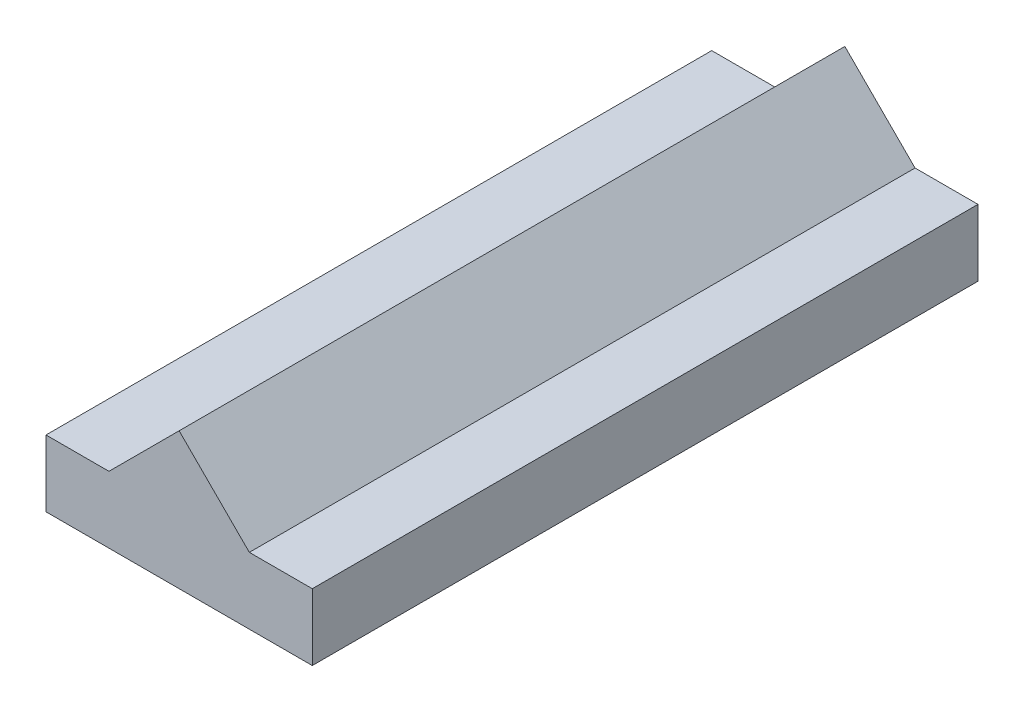
ISO-10303-21;
HEADER;
FILE_DESCRIPTION(('STEP AP214'),'2;1');
FILE_NAME('part.step','',(''),(''),'','','');
FILE_SCHEMA(('AUTOMOTIVE_DESIGN { 1 0 10303 214 1 1 1 1 }'));
ENDSEC;
DATA;
#1=APPLICATION_CONTEXT('core data for automotive mechanical design processes');
#2=APPLICATION_PROTOCOL_DEFINITION('international standard','automotive_design',2000,#1);
#3=PRODUCT_CONTEXT('',#1,'mechanical');
#4=PRODUCT('Part','Part','',(#3));
#5=PRODUCT_RELATED_PRODUCT_CATEGORY('part','',(#4));
#6=PRODUCT_DEFINITION_FORMATION('','',#4);
#7=PRODUCT_DEFINITION_CONTEXT('part definition',#1,'design');
#8=PRODUCT_DEFINITION('design','',#6,#7);
#9=PRODUCT_DEFINITION_SHAPE('','',#8);
#10=(LENGTH_UNIT() NAMED_UNIT(*) SI_UNIT(.MILLI.,.METRE.));
#11=(NAMED_UNIT(*) PLANE_ANGLE_UNIT() SI_UNIT($,.RADIAN.));
#12=(NAMED_UNIT(*) SI_UNIT($,.STERADIAN.) SOLID_ANGLE_UNIT());
#13=UNCERTAINTY_MEASURE_WITH_UNIT(LENGTH_MEASURE(1.E-05),#10,'distance_accuracy_value','');
#14=(GEOMETRIC_REPRESENTATION_CONTEXT(3) GLOBAL_UNCERTAINTY_ASSIGNED_CONTEXT((#13)) GLOBAL_UNIT_ASSIGNED_CONTEXT((#10,
#11,#12)) REPRESENTATION_CONTEXT('',''));
#15=CARTESIAN_POINT('',(0.,0.,0.));
#16=DIRECTION('',(0.,0.,1.));
#17=DIRECTION('',(1.,0.,0.));
#18=AXIS2_PLACEMENT_3D('',#15,#16,#17);
#19=CARTESIAN_POINT('',(-9.99999999999999,0.,50.));
#20=DIRECTION('',(0.,1.,0.));
#21=DIRECTION('',(-1.,0.,0.));
#22=AXIS2_PLACEMENT_3D('',#19,#20,#21);
#23=PLANE('',#22);
#24=DIRECTION('',(1.,0.,0.));
#25=VECTOR('',#24,1.);
#26=CARTESIAN_POINT('',(-9.99999999999999,0.,0.));
#27=LINE('',#26,#25);
#28=CARTESIAN_POINT('',(-9.99999999999999,0.,0.));
#29=VERTEX_POINT('',#28);
#30=CARTESIAN_POINT('',(9.99999999999999,0.,0.));
#31=VERTEX_POINT('',#30);
#32=EDGE_CURVE('E136',#29,#31,#27,.T.);
#33=ORIENTED_EDGE('',*,*,#32,.T.);
#34=DIRECTION('',(0.,0.,-1.));
#35=VECTOR('',#34,1.);
#36=CARTESIAN_POINT('',(9.99999999999999,0.,50.));
#37=LINE('',#36,#35);
#38=CARTESIAN_POINT('',(9.99999999999999,0.,50.));
#39=VERTEX_POINT('',#38);
#40=EDGE_CURVE('E12',#39,#31,#37,.T.);
#41=ORIENTED_EDGE('',*,*,#40,.F.);
#42=DIRECTION('',(1.,0.,0.));
#43=VECTOR('',#42,1.);
#44=CARTESIAN_POINT('',(-9.99999999999999,0.,50.));
#45=LINE('',#44,#43);
#46=CARTESIAN_POINT('',(-9.99999999999999,0.,50.));
#47=VERTEX_POINT('',#46);
#48=EDGE_CURVE('E148',#47,#39,#45,.T.);
#49=ORIENTED_EDGE('',*,*,#48,.F.);
#50=DIRECTION('',(0.,0.,-1.));
#51=VECTOR('',#50,1.);
#52=CARTESIAN_POINT('',(-9.99999999999999,0.,50.));
#53=LINE('',#52,#51);
#54=EDGE_CURVE('E132',#47,#29,#53,.T.);
#55=ORIENTED_EDGE('',*,*,#54,.T.);
#56=EDGE_LOOP('',(#33,#41,#49,#55));
#57=FACE_BOUND('',#56,.T.);
#58=ADVANCED_FACE('F46',(#57),#23,.F.);
#59=CARTESIAN_POINT('',(9.99999999999999,0.,50.));
#60=DIRECTION('',(-1.,0.,0.));
#61=DIRECTION('',(0.,-1.,0.));
#62=AXIS2_PLACEMENT_3D('',#59,#60,#61);
#63=PLANE('',#62);
#64=DIRECTION('',(0.,1.,0.));
#65=VECTOR('',#64,1.);
#66=CARTESIAN_POINT('',(9.99999999999999,0.,0.));
#67=LINE('',#66,#65);
#68=CARTESIAN_POINT('',(10.,5.,0.));
#69=VERTEX_POINT('',#68);
#70=EDGE_CURVE('E139',#31,#69,#67,.T.);
#71=ORIENTED_EDGE('',*,*,#70,.T.);
#72=DIRECTION('',(0.,0.,-1.));
#73=VECTOR('',#72,1.);
#74=CARTESIAN_POINT('',(10.,5.,50.));
#75=LINE('',#74,#73);
#76=CARTESIAN_POINT('',(10.,5.,50.));
#77=VERTEX_POINT('',#76);
#78=EDGE_CURVE('E54',#77,#69,#75,.T.);
#79=ORIENTED_EDGE('',*,*,#78,.F.);
#80=DIRECTION('',(0.,1.,0.));
#81=VECTOR('',#80,1.);
#82=CARTESIAN_POINT('',(9.99999999999999,0.,50.));
#83=LINE('',#82,#81);
#84=EDGE_CURVE('E102',#39,#77,#83,.T.);
#85=ORIENTED_EDGE('',*,*,#84,.F.);
#86=ORIENTED_EDGE('',*,*,#40,.T.);
#87=EDGE_LOOP('',(#71,#79,#85,#86));
#88=FACE_BOUND('',#87,.T.);
#89=ADVANCED_FACE('F173',(#88),#63,.F.);
#90=CARTESIAN_POINT('',(10.,5.,50.));
#91=DIRECTION('',(0.,-1.,0.));
#92=DIRECTION('',(1.,0.,0.));
#93=AXIS2_PLACEMENT_3D('',#90,#91,#92);
#94=PLANE('',#93);
#95=DIRECTION('',(-1.,0.,0.));
#96=VECTOR('',#95,1.);
#97=CARTESIAN_POINT('',(10.,5.,0.));
#98=LINE('',#97,#96);
#99=CARTESIAN_POINT('',(5.27179257857634,5.,0.));
#100=VERTEX_POINT('',#99);
#101=EDGE_CURVE('E141',#69,#100,#98,.T.);
#102=ORIENTED_EDGE('',*,*,#101,.T.);
#103=DIRECTION('',(0.,0.,-1.));
#104=VECTOR('',#103,1.);
#105=CARTESIAN_POINT('',(5.27179257857634,5.,50.));
#106=LINE('',#105,#104);
#107=CARTESIAN_POINT('',(5.27179257857634,5.,50.));
#108=VERTEX_POINT('',#107);
#109=EDGE_CURVE('E152',#108,#100,#106,.T.);
#110=ORIENTED_EDGE('',*,*,#109,.F.);
#111=DIRECTION('',(-1.,0.,0.));
#112=VECTOR('',#111,1.);
#113=CARTESIAN_POINT('',(10.,5.,50.));
#114=LINE('',#113,#112);
#115=EDGE_CURVE('E160',#77,#108,#114,.T.);
#116=ORIENTED_EDGE('',*,*,#115,.F.);
#117=ORIENTED_EDGE('',*,*,#78,.T.);
#118=EDGE_LOOP('',(#102,#110,#116,#117));
#119=FACE_BOUND('',#118,.T.);
#120=ADVANCED_FACE('F158',(#119),#94,.F.);
#121=CARTESIAN_POINT('',(5.27179257857634,5.,50.));
#122=DIRECTION('',(-0.707106781186549,-0.707106781186546,0.));
#123=DIRECTION('',(0.707106781186546,-0.707106781186549,0.));
#124=AXIS2_PLACEMENT_3D('',#121,#122,#123);
#125=PLANE('',#124);
#126=DIRECTION('',(-0.707106781186546,0.707106781186549,0.));
#127=VECTOR('',#126,1.);
#128=CARTESIAN_POINT('',(5.27179257857634,5.,0.));
#129=LINE('',#128,#127);
#130=CARTESIAN_POINT('',(0.,10.2717925785764,0.));
#131=VERTEX_POINT('',#130);
#132=EDGE_CURVE('E143',#100,#131,#129,.T.);
#133=ORIENTED_EDGE('',*,*,#132,.T.);
#134=DIRECTION('',(0.,0.,-1.));
#135=VECTOR('',#134,1.);
#136=CARTESIAN_POINT('',(0.,10.2717925785764,50.));
#137=LINE('',#136,#135);
#138=CARTESIAN_POINT('',(0.,10.2717925785764,50.));
#139=VERTEX_POINT('',#138);
#140=EDGE_CURVE('E127',#139,#131,#137,.T.);
#141=ORIENTED_EDGE('',*,*,#140,.F.);
#142=DIRECTION('',(-0.707106781186546,0.707106781186549,0.));
#143=VECTOR('',#142,1.);
#144=CARTESIAN_POINT('',(5.27179257857634,5.,50.));
#145=LINE('',#144,#143);
#146=EDGE_CURVE('E118',#108,#139,#145,.T.);
#147=ORIENTED_EDGE('',*,*,#146,.F.);
#148=ORIENTED_EDGE('',*,*,#109,.T.);
#149=EDGE_LOOP('',(#133,#141,#147,#148));
#150=FACE_BOUND('',#149,.T.);
#151=ADVANCED_FACE('F166',(#150),#125,.F.);
#152=CARTESIAN_POINT('',(0.,10.2717925785764,50.));
#153=DIRECTION('',(0.70710678118655,-0.707106781186545,0.));
#154=DIRECTION('',(0.707106781186545,0.70710678118655,0.));
#155=AXIS2_PLACEMENT_3D('',#152,#153,#154);
#156=PLANE('',#155);
#157=DIRECTION('',(-0.707106781186545,-0.70710678118655,0.));
#158=VECTOR('',#157,1.);
#159=CARTESIAN_POINT('',(0.,10.2717925785764,0.));
#160=LINE('',#159,#158);
#161=CARTESIAN_POINT('',(-5.27179257857634,4.99999999999998,0.));
#162=VERTEX_POINT('',#161);
#163=EDGE_CURVE('E126',#131,#162,#160,.T.);
#164=ORIENTED_EDGE('',*,*,#163,.T.);
#165=DIRECTION('',(0.,0.,-1.));
#166=VECTOR('',#165,1.);
#167=CARTESIAN_POINT('',(-5.27179257857634,4.99999999999998,50.));
#168=LINE('',#167,#166);
#169=CARTESIAN_POINT('',(-5.27179257857634,4.99999999999998,50.));
#170=VERTEX_POINT('',#169);
#171=EDGE_CURVE('E123',#170,#162,#168,.T.);
#172=ORIENTED_EDGE('',*,*,#171,.F.);
#173=DIRECTION('',(-0.707106781186545,-0.70710678118655,0.));
#174=VECTOR('',#173,1.);
#175=CARTESIAN_POINT('',(0.,10.2717925785764,50.));
#176=LINE('',#175,#174);
#177=EDGE_CURVE('E112',#139,#170,#176,.T.);
#178=ORIENTED_EDGE('',*,*,#177,.F.);
#179=ORIENTED_EDGE('',*,*,#140,.T.);
#180=EDGE_LOOP('',(#164,#172,#178,#179));
#181=FACE_BOUND('',#180,.T.);
#182=ADVANCED_FACE('F124',(#181),#156,.F.);
#183=CARTESIAN_POINT('',(-5.27179257857634,4.99999999999998,50.));
#184=DIRECTION('',(0.,-1.,0.));
#185=DIRECTION('',(1.,0.,0.));
#186=AXIS2_PLACEMENT_3D('',#183,#184,#185);
#187=PLANE('',#186);
#188=DIRECTION('',(-1.,0.,0.));
#189=VECTOR('',#188,1.);
#190=CARTESIAN_POINT('',(-5.27179257857634,4.99999999999998,0.));
#191=LINE('',#190,#189);
#192=CARTESIAN_POINT('',(-9.99999999999999,5.,0.));
#193=VERTEX_POINT('',#192);
#194=EDGE_CURVE('E88',#162,#193,#191,.T.);
#195=ORIENTED_EDGE('',*,*,#194,.T.);
#196=DIRECTION('',(0.,0.,-1.));
#197=VECTOR('',#196,1.);
#198=CARTESIAN_POINT('',(-9.99999999999999,5.,50.));
#199=LINE('',#198,#197);
#200=CARTESIAN_POINT('',(-9.99999999999999,5.,50.));
#201=VERTEX_POINT('',#200);
#202=EDGE_CURVE('E128',#201,#193,#199,.T.);
#203=ORIENTED_EDGE('',*,*,#202,.F.);
#204=DIRECTION('',(-1.,0.,0.));
#205=VECTOR('',#204,1.);
#206=CARTESIAN_POINT('',(-5.27179257857634,4.99999999999998,50.));
#207=LINE('',#206,#205);
#208=EDGE_CURVE('E116',#170,#201,#207,.T.);
#209=ORIENTED_EDGE('',*,*,#208,.F.);
#210=ORIENTED_EDGE('',*,*,#171,.T.);
#211=EDGE_LOOP('',(#195,#203,#209,#210));
#212=FACE_BOUND('',#211,.T.);
#213=ADVANCED_FACE('F130',(#212),#187,.F.);
#214=CARTESIAN_POINT('',(-9.99999999999999,5.,50.));
#215=DIRECTION('',(1.,0.,0.));
#216=DIRECTION('',(0.,0.,-1.));
#217=AXIS2_PLACEMENT_3D('',#214,#215,#216);
#218=PLANE('',#217);
#219=DIRECTION('',(0.,-1.,0.));
#220=VECTOR('',#219,1.);
#221=CARTESIAN_POINT('',(-9.99999999999999,5.,0.));
#222=LINE('',#221,#220);
#223=EDGE_CURVE('E94',#193,#29,#222,.T.);
#224=ORIENTED_EDGE('',*,*,#223,.T.);
#225=ORIENTED_EDGE('',*,*,#54,.F.);
#226=DIRECTION('',(0.,-1.,0.));
#227=VECTOR('',#226,1.);
#228=CARTESIAN_POINT('',(-9.99999999999999,5.,50.));
#229=LINE('',#228,#227);
#230=EDGE_CURVE('E62',#201,#47,#229,.T.);
#231=ORIENTED_EDGE('',*,*,#230,.F.);
#232=ORIENTED_EDGE('',*,*,#202,.T.);
#233=EDGE_LOOP('',(#224,#225,#231,#232));
#234=FACE_BOUND('',#233,.T.);
#235=ADVANCED_FACE('F187',(#234),#218,.F.);
#236=CARTESIAN_POINT('',(0.,0.,50.));
#237=DIRECTION('',(0.,0.,1.));
#238=DIRECTION('',(1.,0.,0.));
#239=AXIS2_PLACEMENT_3D('',#236,#237,#238);
#240=PLANE('',#239);
#241=ORIENTED_EDGE('',*,*,#48,.T.);
#242=ORIENTED_EDGE('',*,*,#84,.T.);
#243=ORIENTED_EDGE('',*,*,#115,.T.);
#244=ORIENTED_EDGE('',*,*,#146,.T.);
#245=ORIENTED_EDGE('',*,*,#177,.T.);
#246=ORIENTED_EDGE('',*,*,#208,.T.);
#247=ORIENTED_EDGE('',*,*,#230,.T.);
#248=EDGE_LOOP('',(#241,#242,#243,#244,#245,#246,#247));
#249=FACE_BOUND('',#248,.T.);
#250=ADVANCED_FACE('F114',(#249),#240,.T.);
#251=CARTESIAN_POINT('',(0.,0.,0.));
#252=DIRECTION('',(0.,0.,1.));
#253=DIRECTION('',(1.,0.,0.));
#254=AXIS2_PLACEMENT_3D('',#251,#252,#253);
#255=PLANE('',#254);
#256=ORIENTED_EDGE('',*,*,#32,.F.);
#257=ORIENTED_EDGE('',*,*,#223,.F.);
#258=ORIENTED_EDGE('',*,*,#194,.F.);
#259=ORIENTED_EDGE('',*,*,#163,.F.);
#260=ORIENTED_EDGE('',*,*,#132,.F.);
#261=ORIENTED_EDGE('',*,*,#101,.F.);
#262=ORIENTED_EDGE('',*,*,#70,.F.);
#263=EDGE_LOOP('',(#256,#257,#258,#259,#260,#261,#262));
#264=FACE_BOUND('',#263,.T.);
#265=ADVANCED_FACE('F164',(#264),#255,.F.);
#266=CLOSED_SHELL('',(#58,#89,#120,#151,#182,#213,#235,#250,#265));
#267=MANIFOLD_SOLID_BREP('B2',#266);
#268=ADVANCED_BREP_SHAPE_REPRESENTATION('',(#18,#267),#14);
#269=SHAPE_DEFINITION_REPRESENTATION(#9,#268);
ENDSEC;
END-ISO-10303-21;
